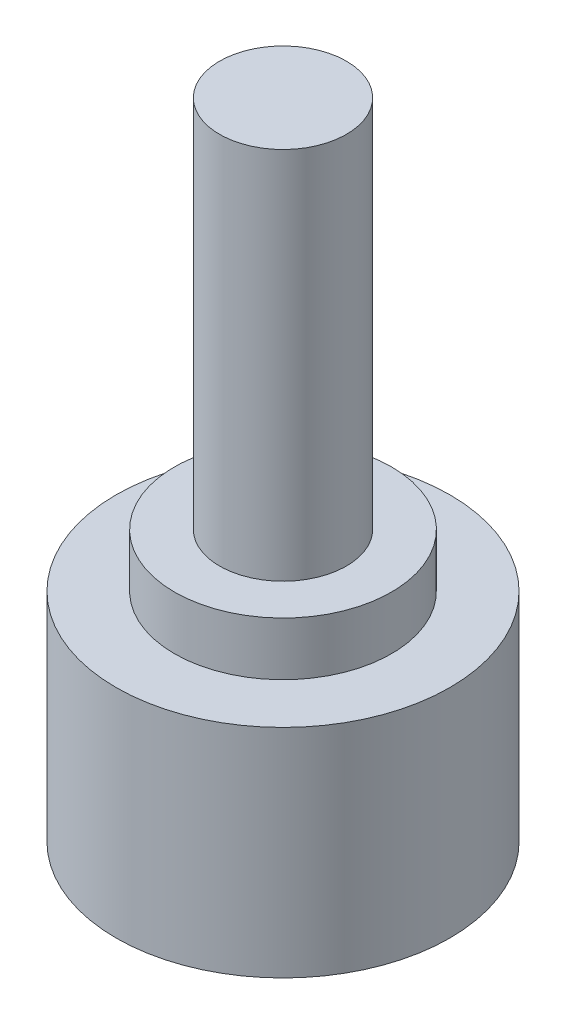
ISO-10303-21;
HEADER;
FILE_DESCRIPTION(('STEP AP214'),'2;1');
FILE_NAME('part.step','',(''),(''),'','','');
FILE_SCHEMA(('AUTOMOTIVE_DESIGN { 1 0 10303 214 1 1 1 1 }'));
ENDSEC;
DATA;
#1=APPLICATION_CONTEXT('core data for automotive mechanical design processes');
#2=APPLICATION_PROTOCOL_DEFINITION('international standard','automotive_design',2000,#1);
#3=PRODUCT_CONTEXT('',#1,'mechanical');
#4=PRODUCT('Part','Part','',(#3));
#5=PRODUCT_RELATED_PRODUCT_CATEGORY('part','',(#4));
#6=PRODUCT_DEFINITION_FORMATION('','',#4);
#7=PRODUCT_DEFINITION_CONTEXT('part definition',#1,'design');
#8=PRODUCT_DEFINITION('design','',#6,#7);
#9=PRODUCT_DEFINITION_SHAPE('','',#8);
#10=(LENGTH_UNIT() NAMED_UNIT(*) SI_UNIT(.MILLI.,.METRE.));
#11=(NAMED_UNIT(*) PLANE_ANGLE_UNIT() SI_UNIT($,.RADIAN.));
#12=(NAMED_UNIT(*) SI_UNIT($,.STERADIAN.) SOLID_ANGLE_UNIT());
#13=UNCERTAINTY_MEASURE_WITH_UNIT(LENGTH_MEASURE(1.E-05),#10,'distance_accuracy_value','');
#14=(GEOMETRIC_REPRESENTATION_CONTEXT(3) GLOBAL_UNCERTAINTY_ASSIGNED_CONTEXT((#13)) GLOBAL_UNIT_ASSIGNED_CONTEXT((#10,
#11,#12)) REPRESENTATION_CONTEXT('',''));
#15=CARTESIAN_POINT('',(0.,0.,0.));
#16=DIRECTION('',(0.,0.,1.));
#17=DIRECTION('',(1.,0.,0.));
#18=AXIS2_PLACEMENT_3D('',#15,#16,#17);
#19=CARTESIAN_POINT('',(0.,0.,0.));
#20=DIRECTION('',(0.,-1.,0.));
#21=DIRECTION('',(0.,0.,-1.));
#22=AXIS2_PLACEMENT_3D('',#19,#20,#21);
#23=CYLINDRICAL_SURFACE('',#22,5.);
#24=CARTESIAN_POINT('',(0.,6.5,0.));
#25=DIRECTION('',(0.,-1.,0.));
#26=DIRECTION('',(0.,0.,-1.));
#27=AXIS2_PLACEMENT_3D('',#24,#25,#26);
#28=CIRCLE('',#27,5.);
#29=CARTESIAN_POINT('',(0.,6.5,-5.));
#30=VERTEX_POINT('',#29);
#31=EDGE_CURVE('E10',#30,#30,#28,.T.);
#32=ORIENTED_EDGE('',*,*,#31,.T.);
#33=EDGE_LOOP('',(#32));
#34=FACE_BOUND('',#33,.T.);
#35=CARTESIAN_POINT('',(0.,0.,0.));
#36=DIRECTION('',(0.,-1.,0.));
#37=DIRECTION('',(0.,0.,-1.));
#38=AXIS2_PLACEMENT_3D('',#35,#36,#37);
#39=CIRCLE('',#38,5.);
#40=CARTESIAN_POINT('',(0.,0.,-5.));
#41=VERTEX_POINT('',#40);
#42=EDGE_CURVE('E30',#41,#41,#39,.T.);
#43=ORIENTED_EDGE('',*,*,#42,.F.);
#44=EDGE_LOOP('',(#43));
#45=FACE_BOUND('',#44,.T.);
#46=ADVANCED_FACE('F14',(#34,#45),#23,.T.);
#47=CARTESIAN_POINT('',(0.,0.,0.));
#48=DIRECTION('',(0.,-1.,0.));
#49=DIRECTION('',(0.,0.,-1.));
#50=AXIS2_PLACEMENT_3D('',#47,#48,#49);
#51=CYLINDRICAL_SURFACE('',#50,3.25);
#52=CARTESIAN_POINT('',(0.,8.1,0.));
#53=DIRECTION('',(0.,-1.,0.));
#54=DIRECTION('',(0.,0.,-1.));
#55=AXIS2_PLACEMENT_3D('',#52,#53,#54);
#56=CIRCLE('',#55,3.25);
#57=CARTESIAN_POINT('',(0.,8.1,-3.25));
#58=VERTEX_POINT('',#57);
#59=EDGE_CURVE('E22',#58,#58,#56,.T.);
#60=ORIENTED_EDGE('',*,*,#59,.T.);
#61=EDGE_LOOP('',(#60));
#62=FACE_BOUND('',#61,.T.);
#63=CARTESIAN_POINT('',(0.,6.5,0.));
#64=DIRECTION('',(0.,-1.,0.));
#65=DIRECTION('',(0.,0.,-1.));
#66=AXIS2_PLACEMENT_3D('',#63,#64,#65);
#67=CIRCLE('',#66,3.25);
#68=CARTESIAN_POINT('',(0.,6.5,-3.25));
#69=VERTEX_POINT('',#68);
#70=EDGE_CURVE('E32',#69,#69,#67,.T.);
#71=ORIENTED_EDGE('',*,*,#70,.F.);
#72=EDGE_LOOP('',(#71));
#73=FACE_BOUND('',#72,.T.);
#74=ADVANCED_FACE('F45',(#62,#73),#51,.T.);
#75=CARTESIAN_POINT('',(0.,0.,0.));
#76=DIRECTION('',(0.,-1.,0.));
#77=DIRECTION('',(0.,0.,-1.));
#78=AXIS2_PLACEMENT_3D('',#75,#76,#77);
#79=CYLINDRICAL_SURFACE('',#78,1.9);
#80=CARTESIAN_POINT('',(0.,19.3,0.));
#81=DIRECTION('',(0.,-1.,0.));
#82=DIRECTION('',(0.,0.,-1.));
#83=AXIS2_PLACEMENT_3D('',#80,#81,#82);
#84=CIRCLE('',#83,1.9);
#85=CARTESIAN_POINT('',(0.,19.3,-1.9));
#86=VERTEX_POINT('',#85);
#87=EDGE_CURVE('E27',#86,#86,#84,.T.);
#88=ORIENTED_EDGE('',*,*,#87,.T.);
#89=EDGE_LOOP('',(#88));
#90=FACE_BOUND('',#89,.T.);
#91=CARTESIAN_POINT('',(0.,8.1,0.));
#92=DIRECTION('',(0.,-1.,0.));
#93=DIRECTION('',(0.,0.,-1.));
#94=AXIS2_PLACEMENT_3D('',#91,#92,#93);
#95=CIRCLE('',#94,1.9);
#96=CARTESIAN_POINT('',(0.,8.1,-1.9));
#97=VERTEX_POINT('',#96);
#98=EDGE_CURVE('E18',#97,#97,#95,.T.);
#99=ORIENTED_EDGE('',*,*,#98,.F.);
#100=EDGE_LOOP('',(#99));
#101=FACE_BOUND('',#100,.T.);
#102=ADVANCED_FACE('F16',(#90,#101),#79,.T.);
#103=CARTESIAN_POINT('',(0.,19.3,0.));
#104=DIRECTION('',(0.,1.,0.));
#105=DIRECTION('',(0.,0.,1.));
#106=AXIS2_PLACEMENT_3D('',#103,#104,#105);
#107=PLANE('',#106);
#108=ORIENTED_EDGE('',*,*,#87,.F.);
#109=EDGE_LOOP('',(#108));
#110=FACE_BOUND('',#109,.T.);
#111=ADVANCED_FACE('F44',(#110),#107,.T.);
#112=CARTESIAN_POINT('',(1.9,8.1,0.));
#113=DIRECTION('',(0.,1.,0.));
#114=DIRECTION('',(0.,0.,1.));
#115=AXIS2_PLACEMENT_3D('',#112,#113,#114);
#116=PLANE('',#115);
#117=ORIENTED_EDGE('',*,*,#59,.F.);
#118=EDGE_LOOP('',(#117));
#119=FACE_BOUND('',#118,.T.);
#120=ORIENTED_EDGE('',*,*,#98,.T.);
#121=EDGE_LOOP('',(#120));
#122=FACE_BOUND('',#121,.T.);
#123=ADVANCED_FACE('F41',(#119,#122),#116,.T.);
#124=CARTESIAN_POINT('',(3.25,6.5,0.));
#125=DIRECTION('',(0.,1.,0.));
#126=DIRECTION('',(0.,0.,1.));
#127=AXIS2_PLACEMENT_3D('',#124,#125,#126);
#128=PLANE('',#127);
#129=ORIENTED_EDGE('',*,*,#31,.F.);
#130=EDGE_LOOP('',(#129));
#131=FACE_BOUND('',#130,.T.);
#132=ORIENTED_EDGE('',*,*,#70,.T.);
#133=EDGE_LOOP('',(#132));
#134=FACE_BOUND('',#133,.T.);
#135=ADVANCED_FACE('F63',(#131,#134),#128,.T.);
#136=CARTESIAN_POINT('',(5.,0.,0.));
#137=DIRECTION('',(0.,-1.,0.));
#138=DIRECTION('',(0.,0.,-1.));
#139=AXIS2_PLACEMENT_3D('',#136,#137,#138);
#140=PLANE('',#139);
#141=ORIENTED_EDGE('',*,*,#42,.T.);
#142=EDGE_LOOP('',(#141));
#143=FACE_BOUND('',#142,.T.);
#144=ADVANCED_FACE('F60',(#143),#140,.T.);
#145=CLOSED_SHELL('',(#46,#74,#102,#111,#123,#135,#144));
#146=MANIFOLD_SOLID_BREP('B1',#145);
#147=ADVANCED_BREP_SHAPE_REPRESENTATION('',(#18,#146),#14);
#148=SHAPE_DEFINITION_REPRESENTATION(#9,#147);
ENDSEC;
END-ISO-10303-21;
